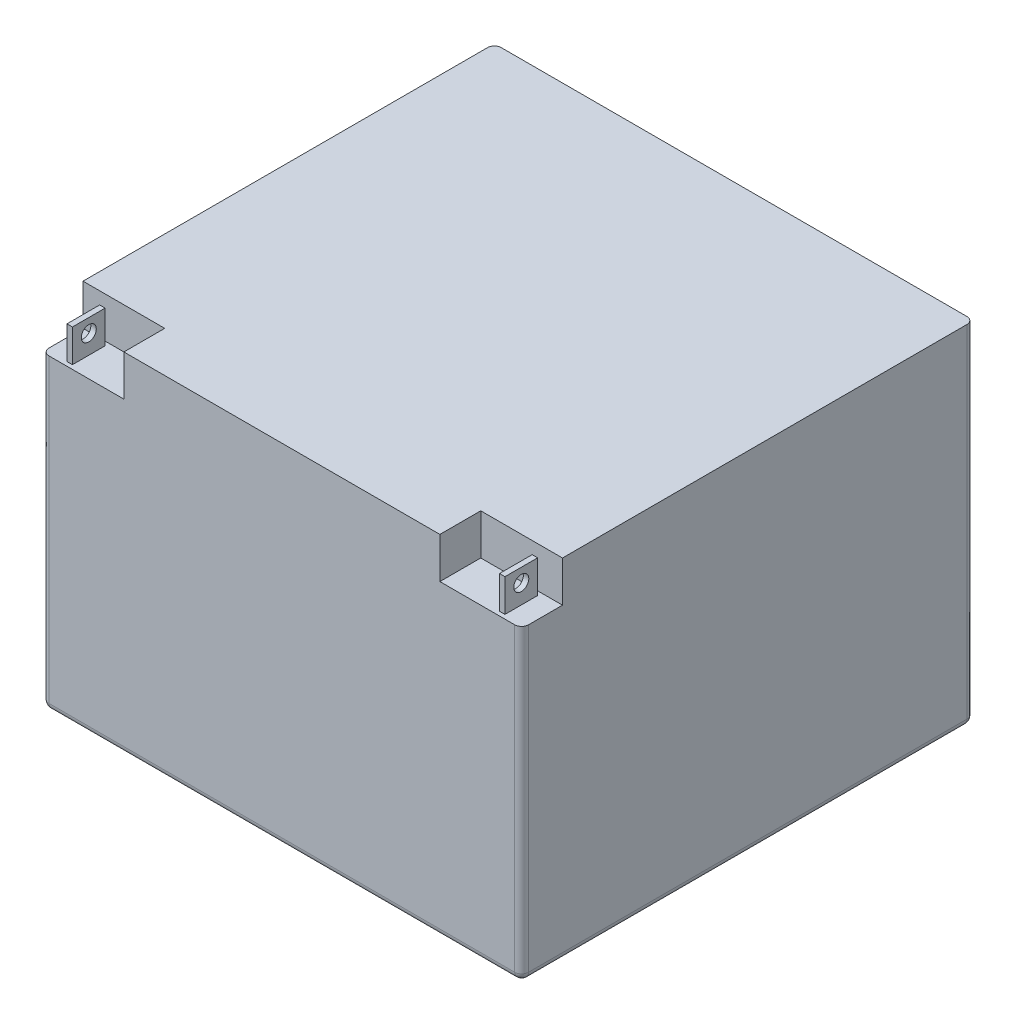
ISO-10303-21;
HEADER;
FILE_DESCRIPTION(('STEP AP214'),'2;1');
FILE_NAME('part.step','',(''),(''),'','','');
FILE_SCHEMA(('AUTOMOTIVE_DESIGN { 1 0 10303 214 1 1 1 1 }'));
ENDSEC;
DATA;
#1=APPLICATION_CONTEXT('core data for automotive mechanical design processes');
#2=APPLICATION_PROTOCOL_DEFINITION('international standard','automotive_design',2000,#1);
#3=PRODUCT_CONTEXT('',#1,'mechanical');
#4=PRODUCT('Part','Part','',(#3));
#5=PRODUCT_RELATED_PRODUCT_CATEGORY('part','',(#4));
#6=PRODUCT_DEFINITION_FORMATION('','',#4);
#7=PRODUCT_DEFINITION_CONTEXT('part definition',#1,'design');
#8=PRODUCT_DEFINITION('design','',#6,#7);
#9=PRODUCT_DEFINITION_SHAPE('','',#8);
#10=(LENGTH_UNIT() NAMED_UNIT(*) SI_UNIT(.MILLI.,.METRE.));
#11=(NAMED_UNIT(*) PLANE_ANGLE_UNIT() SI_UNIT($,.RADIAN.));
#12=(NAMED_UNIT(*) SI_UNIT($,.STERADIAN.) SOLID_ANGLE_UNIT());
#13=UNCERTAINTY_MEASURE_WITH_UNIT(LENGTH_MEASURE(1.E-05),#10,'distance_accuracy_value','');
#14=(GEOMETRIC_REPRESENTATION_CONTEXT(3) GLOBAL_UNCERTAINTY_ASSIGNED_CONTEXT((#13)) GLOBAL_UNIT_ASSIGNED_CONTEXT((#10,
#11,#12)) REPRESENTATION_CONTEXT('',''));
#15=CARTESIAN_POINT('',(0.,0.,0.));
#16=DIRECTION('',(0.,0.,1.));
#17=DIRECTION('',(1.,0.,0.));
#18=AXIS2_PLACEMENT_3D('',#15,#16,#17);
#19=CARTESIAN_POINT('',(0.,113.,0.));
#20=DIRECTION('',(0.,1.,0.));
#21=DIRECTION('',(0.,0.,1.));
#22=AXIS2_PLACEMENT_3D('',#19,#20,#21);
#23=PLANE('',#22);
#24=DIRECTION('',(-1.,0.,0.));
#25=VECTOR('',#24,1.);
#26=CARTESIAN_POINT('',(0.,113.,0.));
#27=LINE('',#26,#25);
#28=CARTESIAN_POINT('',(-58.,113.,0.));
#29=VERTEX_POINT('',#28);
#30=CARTESIAN_POINT('',(-85.46,113.,0.));
#31=VERTEX_POINT('',#30);
#32=EDGE_CURVE('E259',#29,#31,#27,.T.);
#33=ORIENTED_EDGE('',*,*,#32,.F.);
#34=DIRECTION('',(0.,0.,1.));
#35=VECTOR('',#34,1.);
#36=CARTESIAN_POINT('',(-58.,113.,0.));
#37=LINE('',#36,#35);
#38=CARTESIAN_POINT('',(-58.,113.,-15.));
#39=VERTEX_POINT('',#38);
#40=EDGE_CURVE('E262',#39,#29,#37,.T.);
#41=ORIENTED_EDGE('',*,*,#40,.F.);
#42=DIRECTION('',(1.,0.,0.));
#43=VECTOR('',#42,1.);
#44=CARTESIAN_POINT('',(0.,113.,-15.));
#45=LINE('',#44,#43);
#46=CARTESIAN_POINT('',(-88.,113.,-15.));
#47=VERTEX_POINT('',#46);
#48=EDGE_CURVE('E252',#47,#39,#45,.T.);
#49=ORIENTED_EDGE('',*,*,#48,.F.);
#50=DIRECTION('',(0.,0.,-1.));
#51=VECTOR('',#50,1.);
#52=CARTESIAN_POINT('',(-88.,113.,0.));
#53=LINE('',#52,#51);
#54=CARTESIAN_POINT('',(-88.,113.,-2.54));
#55=VERTEX_POINT('',#54);
#56=EDGE_CURVE('E255',#55,#47,#53,.T.);
#57=ORIENTED_EDGE('',*,*,#56,.F.);
#58=CARTESIAN_POINT('',(-85.46,113.,-2.54));
#59=DIRECTION('',(0.,1.,0.));
#60=DIRECTION('',(0.,0.,1.));
#61=AXIS2_PLACEMENT_3D('',#58,#59,#60);
#62=CIRCLE('',#61,2.54);
#63=EDGE_CURVE('E11',#31,#55,#62,.F.);
#64=ORIENTED_EDGE('',*,*,#63,.F.);
#65=EDGE_LOOP('',(#33,#41,#49,#57,#64));
#66=FACE_BOUND('',#65,.T.);
#67=DIRECTION('',(-1.,0.,0.));
#68=VECTOR('',#67,1.);
#69=CARTESIAN_POINT('',(-78.38,113.,-13.5));
#70=LINE('',#69,#68);
#71=CARTESIAN_POINT('',(-78.38,113.,-13.5));
#72=VERTEX_POINT('',#71);
#73=CARTESIAN_POINT('',(-80.38,113.,-13.5));
#74=VERTEX_POINT('',#73);
#75=EDGE_CURVE('E58',#72,#74,#70,.T.);
#76=ORIENTED_EDGE('',*,*,#75,.F.);
#77=DIRECTION('',(0.,0.,1.));
#78=VECTOR('',#77,1.);
#79=CARTESIAN_POINT('',(-78.38,113.,0.));
#80=LINE('',#79,#78);
#81=CARTESIAN_POINT('',(-78.38,113.,-1.5));
#82=VERTEX_POINT('',#81);
#83=EDGE_CURVE('E63',#72,#82,#80,.T.);
#84=ORIENTED_EDGE('',*,*,#83,.T.);
#85=DIRECTION('',(-1.,0.,0.));
#86=VECTOR('',#85,1.);
#87=CARTESIAN_POINT('',(-78.38,113.,-1.5));
#88=LINE('',#87,#86);
#89=CARTESIAN_POINT('',(-80.38,113.,-1.5));
#90=VERTEX_POINT('',#89);
#91=EDGE_CURVE('E220',#82,#90,#88,.T.);
#92=ORIENTED_EDGE('',*,*,#91,.T.);
#93=DIRECTION('',(0.,0.,1.));
#94=VECTOR('',#93,1.);
#95=CARTESIAN_POINT('',(-80.38,113.,0.));
#96=LINE('',#95,#94);
#97=EDGE_CURVE('E239',#74,#90,#96,.T.);
#98=ORIENTED_EDGE('',*,*,#97,.F.);
#99=EDGE_LOOP('',(#76,#84,#92,#98));
#100=FACE_BOUND('',#99,.T.);
#101=ADVANCED_FACE('F43',(#66,#100),#23,.T.);
#102=CARTESIAN_POINT('',(-88.,128.,0.));
#103=DIRECTION('',(1.,0.,0.));
#104=DIRECTION('',(0.,0.,-1.));
#105=AXIS2_PLACEMENT_3D('',#102,#103,#104);
#106=PLANE('',#105);
#107=DIRECTION('',(0.,1.,0.));
#108=VECTOR('',#107,1.);
#109=CARTESIAN_POINT('',(-88.,113.,-15.));
#110=LINE('',#109,#108);
#111=CARTESIAN_POINT('',(-88.,128.,-15.));
#112=VERTEX_POINT('',#111);
#113=EDGE_CURVE('E264',#47,#112,#110,.T.);
#114=ORIENTED_EDGE('',*,*,#113,.T.);
#115=DIRECTION('',(0.,0.,1.));
#116=VECTOR('',#115,1.);
#117=CARTESIAN_POINT('',(-88.,128.,0.));
#118=LINE('',#117,#116);
#119=CARTESIAN_POINT('',(-88.,128.,-163.46));
#120=VERTEX_POINT('',#119);
#121=EDGE_CURVE('E340',#120,#112,#118,.T.);
#122=ORIENTED_EDGE('',*,*,#121,.F.);
#123=DIRECTION('',(0.,-1.,0.));
#124=VECTOR('',#123,1.);
#125=CARTESIAN_POINT('',(-88.,128.,-163.46));
#126=LINE('',#125,#124);
#127=CARTESIAN_POINT('',(-88.,2.53999999999999,-163.46));
#128=VERTEX_POINT('',#127);
#129=EDGE_CURVE('E384',#120,#128,#126,.T.);
#130=ORIENTED_EDGE('',*,*,#129,.T.);
#131=DIRECTION('',(0.,0.,1.));
#132=VECTOR('',#131,1.);
#133=CARTESIAN_POINT('',(-88.,2.53999999999999,0.));
#134=LINE('',#133,#132);
#135=CARTESIAN_POINT('',(-88.,2.53999999999999,-2.54));
#136=VERTEX_POINT('',#135);
#137=EDGE_CURVE('E378',#128,#136,#134,.T.);
#138=ORIENTED_EDGE('',*,*,#137,.T.);
#139=DIRECTION('',(0.,-1.,0.));
#140=VECTOR('',#139,1.);
#141=CARTESIAN_POINT('',(-88.,128.,-2.54));
#142=LINE('',#141,#140);
#143=EDGE_CURVE('E381',#136,#55,#142,.F.);
#144=ORIENTED_EDGE('',*,*,#143,.T.);
#145=ORIENTED_EDGE('',*,*,#56,.T.);
#146=EDGE_LOOP('',(#114,#122,#130,#138,#144,#145));
#147=FACE_BOUND('',#146,.T.);
#148=ADVANCED_FACE('F501',(#147),#106,.F.);
#149=CARTESIAN_POINT('',(-88.,128.,0.));
#150=DIRECTION('',(0.,0.,-1.));
#151=DIRECTION('',(-1.,0.,0.));
#152=AXIS2_PLACEMENT_3D('',#149,#150,#151);
#153=PLANE('',#152);
#154=DIRECTION('',(0.,1.,0.));
#155=VECTOR('',#154,1.);
#156=CARTESIAN_POINT('',(-58.,113.,0.));
#157=LINE('',#156,#155);
#158=CARTESIAN_POINT('',(-58.,128.,0.));
#159=VERTEX_POINT('',#158);
#160=EDGE_CURVE('E273',#29,#159,#157,.T.);
#161=ORIENTED_EDGE('',*,*,#160,.F.);
#162=ORIENTED_EDGE('',*,*,#32,.T.);
#163=DIRECTION('',(0.,-1.,0.));
#164=VECTOR('',#163,1.);
#165=CARTESIAN_POINT('',(-85.46,128.,0.));
#166=LINE('',#165,#164);
#167=CARTESIAN_POINT('',(-85.46,2.53999999999999,0.));
#168=VERTEX_POINT('',#167);
#169=EDGE_CURVE('E391',#31,#168,#166,.T.);
#170=ORIENTED_EDGE('',*,*,#169,.T.);
#171=DIRECTION('',(1.,0.,0.));
#172=VECTOR('',#171,1.);
#173=CARTESIAN_POINT('',(88.,2.53999999999999,0.));
#174=LINE('',#173,#172);
#175=CARTESIAN_POINT('',(85.46,2.53999999999999,0.));
#176=VERTEX_POINT('',#175);
#177=EDGE_CURVE('E387',#168,#176,#174,.T.);
#178=ORIENTED_EDGE('',*,*,#177,.T.);
#179=DIRECTION('',(0.,-1.,0.));
#180=VECTOR('',#179,1.);
#181=CARTESIAN_POINT('',(85.46,128.,0.));
#182=LINE('',#181,#180);
#183=CARTESIAN_POINT('',(85.46,113.,0.));
#184=VERTEX_POINT('',#183);
#185=EDGE_CURVE('E389',#176,#184,#182,.F.);
#186=ORIENTED_EDGE('',*,*,#185,.T.);
#187=DIRECTION('',(1.,0.,0.));
#188=VECTOR('',#187,1.);
#189=CARTESIAN_POINT('',(0.,113.,0.));
#190=LINE('',#189,#188);
#191=CARTESIAN_POINT('',(58.,113.,0.));
#192=VERTEX_POINT('',#191);
#193=EDGE_CURVE('E325',#192,#184,#190,.T.);
#194=ORIENTED_EDGE('',*,*,#193,.F.);
#195=DIRECTION('',(0.,1.,0.));
#196=VECTOR('',#195,1.);
#197=CARTESIAN_POINT('',(58.,113.,0.));
#198=LINE('',#197,#196);
#199=CARTESIAN_POINT('',(58.,128.,0.));
#200=VERTEX_POINT('',#199);
#201=EDGE_CURVE('E341',#192,#200,#198,.T.);
#202=ORIENTED_EDGE('',*,*,#201,.T.);
#203=DIRECTION('',(1.,0.,0.));
#204=VECTOR('',#203,1.);
#205=CARTESIAN_POINT('',(-88.,128.,0.));
#206=LINE('',#205,#204);
#207=EDGE_CURVE('E350',#159,#200,#206,.T.);
#208=ORIENTED_EDGE('',*,*,#207,.F.);
#209=EDGE_LOOP('',(#161,#162,#170,#178,#186,#194,#202,#208));
#210=FACE_BOUND('',#209,.T.);
#211=ADVANCED_FACE('F464',(#210),#153,.F.);
#212=CARTESIAN_POINT('',(0.,128.,0.));
#213=DIRECTION('',(0.,-1.,0.));
#214=DIRECTION('',(0.,0.,-1.));
#215=AXIS2_PLACEMENT_3D('',#212,#213,#214);
#216=PLANE('',#215);
#217=DIRECTION('',(1.,0.,0.));
#218=VECTOR('',#217,1.);
#219=CARTESIAN_POINT('',(0.,128.,-15.));
#220=LINE('',#219,#218);
#221=CARTESIAN_POINT('',(-58.,128.,-15.));
#222=VERTEX_POINT('',#221);
#223=EDGE_CURVE('E249',#112,#222,#220,.T.);
#224=ORIENTED_EDGE('',*,*,#223,.T.);
#225=DIRECTION('',(0.,0.,1.));
#226=VECTOR('',#225,1.);
#227=CARTESIAN_POINT('',(-58.,128.,0.));
#228=LINE('',#227,#226);
#229=EDGE_CURVE('E256',#222,#159,#228,.T.);
#230=ORIENTED_EDGE('',*,*,#229,.T.);
#231=ORIENTED_EDGE('',*,*,#207,.T.);
#232=DIRECTION('',(0.,0.,1.));
#233=VECTOR('',#232,1.);
#234=CARTESIAN_POINT('',(58.,128.,0.));
#235=LINE('',#234,#233);
#236=CARTESIAN_POINT('',(58.,128.,-15.));
#237=VERTEX_POINT('',#236);
#238=EDGE_CURVE('E321',#237,#200,#235,.T.);
#239=ORIENTED_EDGE('',*,*,#238,.F.);
#240=DIRECTION('',(-1.,0.,0.));
#241=VECTOR('',#240,1.);
#242=CARTESIAN_POINT('',(0.,128.,-15.));
#243=LINE('',#242,#241);
#244=CARTESIAN_POINT('',(88.,128.,-15.));
#245=VERTEX_POINT('',#244);
#246=EDGE_CURVE('E331',#245,#237,#243,.T.);
#247=ORIENTED_EDGE('',*,*,#246,.F.);
#248=DIRECTION('',(0.,0.,-1.));
#249=VECTOR('',#248,1.);
#250=CARTESIAN_POINT('',(88.,128.,0.));
#251=LINE('',#250,#249);
#252=CARTESIAN_POINT('',(88.,128.,-163.46));
#253=VERTEX_POINT('',#252);
#254=EDGE_CURVE('E353',#245,#253,#251,.T.);
#255=ORIENTED_EDGE('',*,*,#254,.T.);
#256=CARTESIAN_POINT('',(85.46,128.,-163.46));
#257=DIRECTION('',(0.,-1.,0.));
#258=DIRECTION('',(0.,0.,-1.));
#259=AXIS2_PLACEMENT_3D('',#256,#257,#258);
#260=CIRCLE('',#259,2.54);
#261=CARTESIAN_POINT('',(85.46,128.,-166.));
#262=VERTEX_POINT('',#261);
#263=EDGE_CURVE('E376',#253,#262,#260,.F.);
#264=ORIENTED_EDGE('',*,*,#263,.T.);
#265=DIRECTION('',(-1.,0.,0.));
#266=VECTOR('',#265,1.);
#267=CARTESIAN_POINT('',(-88.,128.,-166.));
#268=LINE('',#267,#266);
#269=CARTESIAN_POINT('',(-85.46,128.,-166.));
#270=VERTEX_POINT('',#269);
#271=EDGE_CURVE('E356',#262,#270,#268,.T.);
#272=ORIENTED_EDGE('',*,*,#271,.T.);
#273=CARTESIAN_POINT('',(-85.46,128.,-163.46));
#274=DIRECTION('',(0.,-1.,0.));
#275=DIRECTION('',(0.,0.,-1.));
#276=AXIS2_PLACEMENT_3D('',#273,#274,#275);
#277=CIRCLE('',#276,2.54);
#278=EDGE_CURVE('E374',#270,#120,#277,.F.);
#279=ORIENTED_EDGE('',*,*,#278,.T.);
#280=ORIENTED_EDGE('',*,*,#121,.T.);
#281=EDGE_LOOP('',(#224,#230,#231,#239,#247,#255,#264,#272,#279,#280));
#282=FACE_BOUND('',#281,.T.);
#283=ADVANCED_FACE('F486',(#282),#216,.F.);
#284=CARTESIAN_POINT('',(-85.46,128.,-2.54));
#285=DIRECTION('',(0.,-1.,0.));
#286=DIRECTION('',(0.,0.,-1.));
#287=AXIS2_PLACEMENT_3D('',#284,#285,#286);
#288=CYLINDRICAL_SURFACE('',#287,2.54);
#289=ORIENTED_EDGE('',*,*,#169,.F.);
#290=ORIENTED_EDGE('',*,*,#63,.T.);
#291=ORIENTED_EDGE('',*,*,#143,.F.);
#292=CARTESIAN_POINT('',(-85.46,2.53999999999999,-2.54));
#293=DIRECTION('',(0.,-1.,0.));
#294=DIRECTION('',(0.,0.,-1.));
#295=AXIS2_PLACEMENT_3D('',#292,#293,#294);
#296=CIRCLE('',#295,2.54);
#297=EDGE_CURVE('E334',#168,#136,#296,.T.);
#298=ORIENTED_EDGE('',*,*,#297,.F.);
#299=EDGE_LOOP('',(#289,#290,#291,#298));
#300=FACE_BOUND('',#299,.T.);
#301=ADVANCED_FACE('F45',(#300),#288,.T.);
#302=CARTESIAN_POINT('',(0.,113.,0.));
#303=DIRECTION('',(0.,1.,0.));
#304=DIRECTION('',(0.,0.,1.));
#305=AXIS2_PLACEMENT_3D('',#302,#303,#304);
#306=PLANE('',#305);
#307=ORIENTED_EDGE('',*,*,#193,.T.);
#308=CARTESIAN_POINT('',(85.46,113.,-2.54));
#309=DIRECTION('',(0.,1.,0.));
#310=DIRECTION('',(0.,0.,1.));
#311=AXIS2_PLACEMENT_3D('',#308,#309,#310);
#312=CIRCLE('',#311,2.54);
#313=CARTESIAN_POINT('',(88.,113.,-2.54));
#314=VERTEX_POINT('',#313);
#315=EDGE_CURVE('E393',#184,#314,#312,.T.);
#316=ORIENTED_EDGE('',*,*,#315,.T.);
#317=DIRECTION('',(0.,0.,-1.));
#318=VECTOR('',#317,1.);
#319=CARTESIAN_POINT('',(88.,113.,0.));
#320=LINE('',#319,#318);
#321=CARTESIAN_POINT('',(88.,113.,-15.));
#322=VERTEX_POINT('',#321);
#323=EDGE_CURVE('E328',#314,#322,#320,.T.);
#324=ORIENTED_EDGE('',*,*,#323,.T.);
#325=DIRECTION('',(-1.,0.,0.));
#326=VECTOR('',#325,1.);
#327=CARTESIAN_POINT('',(0.,113.,-15.));
#328=LINE('',#327,#326);
#329=CARTESIAN_POINT('',(58.,113.,-15.));
#330=VERTEX_POINT('',#329);
#331=EDGE_CURVE('E316',#322,#330,#328,.T.);
#332=ORIENTED_EDGE('',*,*,#331,.T.);
#333=DIRECTION('',(0.,0.,1.));
#334=VECTOR('',#333,1.);
#335=CARTESIAN_POINT('',(58.,113.,0.));
#336=LINE('',#335,#334);
#337=EDGE_CURVE('E320',#330,#192,#336,.T.);
#338=ORIENTED_EDGE('',*,*,#337,.T.);
#339=EDGE_LOOP('',(#307,#316,#324,#332,#338));
#340=FACE_BOUND('',#339,.T.);
#341=DIRECTION('',(1.,0.,0.));
#342=VECTOR('',#341,1.);
#343=CARTESIAN_POINT('',(78.38,113.,-1.5));
#344=LINE('',#343,#342);
#345=CARTESIAN_POINT('',(78.38,113.,-1.5));
#346=VERTEX_POINT('',#345);
#347=CARTESIAN_POINT('',(80.38,113.,-1.5));
#348=VERTEX_POINT('',#347);
#349=EDGE_CURVE('E305',#346,#348,#344,.T.);
#350=ORIENTED_EDGE('',*,*,#349,.F.);
#351=DIRECTION('',(0.,0.,1.));
#352=VECTOR('',#351,1.);
#353=CARTESIAN_POINT('',(78.38,113.,0.));
#354=LINE('',#353,#352);
#355=CARTESIAN_POINT('',(78.38,113.,-13.5));
#356=VERTEX_POINT('',#355);
#357=EDGE_CURVE('E280',#356,#346,#354,.T.);
#358=ORIENTED_EDGE('',*,*,#357,.F.);
#359=DIRECTION('',(1.,0.,0.));
#360=VECTOR('',#359,1.);
#361=CARTESIAN_POINT('',(78.38,113.,-13.5));
#362=LINE('',#361,#360);
#363=CARTESIAN_POINT('',(80.38,113.,-13.5));
#364=VERTEX_POINT('',#363);
#365=EDGE_CURVE('E293',#356,#364,#362,.T.);
#366=ORIENTED_EDGE('',*,*,#365,.T.);
#367=DIRECTION('',(0.,0.,1.));
#368=VECTOR('',#367,1.);
#369=CARTESIAN_POINT('',(80.38,113.,0.));
#370=LINE('',#369,#368);
#371=EDGE_CURVE('E296',#364,#348,#370,.T.);
#372=ORIENTED_EDGE('',*,*,#371,.T.);
#373=EDGE_LOOP('',(#350,#358,#366,#372));
#374=FACE_BOUND('',#373,.T.);
#375=ADVANCED_FACE('F474',(#340,#374),#306,.T.);
#376=CARTESIAN_POINT('',(88.,128.,0.));
#377=DIRECTION('',(-1.,0.,0.));
#378=DIRECTION('',(0.,0.,1.));
#379=AXIS2_PLACEMENT_3D('',#376,#377,#378);
#380=PLANE('',#379);
#381=DIRECTION('',(0.,0.,-1.));
#382=VECTOR('',#381,1.);
#383=CARTESIAN_POINT('',(88.,2.53999999999999,-166.));
#384=LINE('',#383,#382);
#385=CARTESIAN_POINT('',(88.,2.53999999999999,-2.54));
#386=VERTEX_POINT('',#385);
#387=CARTESIAN_POINT('',(88.,2.53999999999999,-163.46));
#388=VERTEX_POINT('',#387);
#389=EDGE_CURVE('E368',#386,#388,#384,.T.);
#390=ORIENTED_EDGE('',*,*,#389,.T.);
#391=DIRECTION('',(0.,-1.,0.));
#392=VECTOR('',#391,1.);
#393=CARTESIAN_POINT('',(88.,128.,-163.46));
#394=LINE('',#393,#392);
#395=EDGE_CURVE('E372',#388,#253,#394,.F.);
#396=ORIENTED_EDGE('',*,*,#395,.T.);
#397=ORIENTED_EDGE('',*,*,#254,.F.);
#398=DIRECTION('',(0.,1.,0.));
#399=VECTOR('',#398,1.);
#400=CARTESIAN_POINT('',(88.,113.,-15.));
#401=LINE('',#400,#399);
#402=EDGE_CURVE('E338',#322,#245,#401,.T.);
#403=ORIENTED_EDGE('',*,*,#402,.F.);
#404=ORIENTED_EDGE('',*,*,#323,.F.);
#405=DIRECTION('',(0.,-1.,0.));
#406=VECTOR('',#405,1.);
#407=CARTESIAN_POINT('',(88.,128.,-2.54));
#408=LINE('',#407,#406);
#409=EDGE_CURVE('E370',#314,#386,#408,.T.);
#410=ORIENTED_EDGE('',*,*,#409,.T.);
#411=EDGE_LOOP('',(#390,#396,#397,#403,#404,#410));
#412=FACE_BOUND('',#411,.T.);
#413=ADVANCED_FACE('F479',(#412),#380,.F.);
#414=CARTESIAN_POINT('',(-88.,128.,-166.));
#415=DIRECTION('',(0.,0.,1.));
#416=DIRECTION('',(1.,0.,0.));
#417=AXIS2_PLACEMENT_3D('',#414,#415,#416);
#418=PLANE('',#417);
#419=ORIENTED_EDGE('',*,*,#271,.F.);
#420=DIRECTION('',(0.,-1.,0.));
#421=VECTOR('',#420,1.);
#422=CARTESIAN_POINT('',(85.46,128.,-166.));
#423=LINE('',#422,#421);
#424=CARTESIAN_POINT('',(85.46,2.53999999999999,-166.));
#425=VERTEX_POINT('',#424);
#426=EDGE_CURVE('E365',#262,#425,#423,.T.);
#427=ORIENTED_EDGE('',*,*,#426,.T.);
#428=DIRECTION('',(-1.,0.,0.));
#429=VECTOR('',#428,1.);
#430=CARTESIAN_POINT('',(-88.,2.53999999999999,-166.));
#431=LINE('',#430,#429);
#432=CARTESIAN_POINT('',(-85.46,2.53999999999999,-166.));
#433=VERTEX_POINT('',#432);
#434=EDGE_CURVE('E359',#425,#433,#431,.T.);
#435=ORIENTED_EDGE('',*,*,#434,.T.);
#436=DIRECTION('',(0.,-1.,0.));
#437=VECTOR('',#436,1.);
#438=CARTESIAN_POINT('',(-85.46,128.,-166.));
#439=LINE('',#438,#437);
#440=EDGE_CURVE('E362',#433,#270,#439,.F.);
#441=ORIENTED_EDGE('',*,*,#440,.T.);
#442=EDGE_LOOP('',(#419,#427,#435,#441));
#443=FACE_BOUND('',#442,.T.);
#444=ADVANCED_FACE('F557',(#443),#418,.F.);
#445=CARTESIAN_POINT('',(0.,0.,0.));
#446=DIRECTION('',(0.,-1.,0.));
#447=DIRECTION('',(0.,0.,-1.));
#448=AXIS2_PLACEMENT_3D('',#445,#446,#447);
#449=PLANE('',#448);
#450=DIRECTION('',(0.,0.,1.));
#451=VECTOR('',#450,1.);
#452=CARTESIAN_POINT('',(-85.46,0.,-166.));
#453=LINE('',#452,#451);
#454=CARTESIAN_POINT('',(-85.46,0.,-2.54));
#455=VERTEX_POINT('',#454);
#456=CARTESIAN_POINT('',(-85.46,0.,-163.46));
#457=VERTEX_POINT('',#456);
#458=EDGE_CURVE('E399',#455,#457,#453,.F.);
#459=ORIENTED_EDGE('',*,*,#458,.T.);
#460=DIRECTION('',(-1.,0.,0.));
#461=VECTOR('',#460,1.);
#462=CARTESIAN_POINT('',(88.,0.,-163.46));
#463=LINE('',#462,#461);
#464=CARTESIAN_POINT('',(85.46,0.,-163.46));
#465=VERTEX_POINT('',#464);
#466=EDGE_CURVE('E51',#457,#465,#463,.F.);
#467=ORIENTED_EDGE('',*,*,#466,.T.);
#468=DIRECTION('',(0.,0.,-1.));
#469=VECTOR('',#468,1.);
#470=CARTESIAN_POINT('',(85.46,0.,0.));
#471=LINE('',#470,#469);
#472=CARTESIAN_POINT('',(85.46,0.,-2.54));
#473=VERTEX_POINT('',#472);
#474=EDGE_CURVE('E395',#465,#473,#471,.F.);
#475=ORIENTED_EDGE('',*,*,#474,.T.);
#476=DIRECTION('',(1.,0.,0.));
#477=VECTOR('',#476,1.);
#478=CARTESIAN_POINT('',(-88.,0.,-2.54));
#479=LINE('',#478,#477);
#480=EDGE_CURVE('E397',#473,#455,#479,.F.);
#481=ORIENTED_EDGE('',*,*,#480,.T.);
#482=EDGE_LOOP('',(#459,#467,#475,#481));
#483=FACE_BOUND('',#482,.T.);
#484=ADVANCED_FACE('F454',(#483),#449,.T.);
#485=CARTESIAN_POINT('',(0.,113.,-15.));
#486=DIRECTION('',(0.,0.,-1.));
#487=DIRECTION('',(-1.,0.,0.));
#488=AXIS2_PLACEMENT_3D('',#485,#486,#487);
#489=PLANE('',#488);
#490=ORIENTED_EDGE('',*,*,#246,.T.);
#491=DIRECTION('',(0.,1.,0.));
#492=VECTOR('',#491,1.);
#493=CARTESIAN_POINT('',(58.,113.,-15.));
#494=LINE('',#493,#492);
#495=EDGE_CURVE('E330',#330,#237,#494,.T.);
#496=ORIENTED_EDGE('',*,*,#495,.F.);
#497=ORIENTED_EDGE('',*,*,#331,.F.);
#498=ORIENTED_EDGE('',*,*,#402,.T.);
#499=EDGE_LOOP('',(#490,#496,#497,#498));
#500=FACE_BOUND('',#499,.T.);
#501=ADVANCED_FACE('F483',(#500),#489,.F.);
#502=CARTESIAN_POINT('',(58.,113.,0.));
#503=DIRECTION('',(-1.,0.,0.));
#504=DIRECTION('',(0.,0.,1.));
#505=AXIS2_PLACEMENT_3D('',#502,#503,#504);
#506=PLANE('',#505);
#507=ORIENTED_EDGE('',*,*,#238,.T.);
#508=ORIENTED_EDGE('',*,*,#201,.F.);
#509=ORIENTED_EDGE('',*,*,#337,.F.);
#510=ORIENTED_EDGE('',*,*,#495,.T.);
#511=EDGE_LOOP('',(#507,#508,#509,#510));
#512=FACE_BOUND('',#511,.T.);
#513=ADVANCED_FACE('F490',(#512),#506,.F.);
#514=CARTESIAN_POINT('',(-85.46,2.54,-2.54));
#515=DIRECTION('',(0.,0.,1.));
#516=DIRECTION('',(1.,0.,0.));
#517=AXIS2_PLACEMENT_3D('',#514,#515,#516);
#518=SPHERICAL_SURFACE('',#517,2.54);
#519=CARTESIAN_POINT('',(-85.46,2.54,-2.54));
#520=DIRECTION('',(-1.,0.,0.));
#521=DIRECTION('',(0.,0.,1.));
#522=AXIS2_PLACEMENT_3D('',#519,#520,#521);
#523=CIRCLE('',#522,2.54);
#524=EDGE_CURVE('E431',#168,#455,#523,.F.);
#525=ORIENTED_EDGE('',*,*,#524,.F.);
#526=ORIENTED_EDGE('',*,*,#297,.T.);
#527=CARTESIAN_POINT('',(-85.46,2.53999999999999,-2.54));
#528=DIRECTION('',(0.,0.,1.));
#529=DIRECTION('',(1.,0.,0.));
#530=AXIS2_PLACEMENT_3D('',#527,#528,#529);
#531=CIRCLE('',#530,2.54);
#532=EDGE_CURVE('E434',#455,#136,#531,.F.);
#533=ORIENTED_EDGE('',*,*,#532,.F.);
#534=EDGE_LOOP('',(#525,#526,#533));
#535=FACE_BOUND('',#534,.T.);
#536=ADVANCED_FACE('F441',(#535),#518,.T.);
#537=CARTESIAN_POINT('',(-85.46,128.,-163.46));
#538=DIRECTION('',(0.,-1.,0.));
#539=DIRECTION('',(0.,0.,-1.));
#540=AXIS2_PLACEMENT_3D('',#537,#538,#539);
#541=CYLINDRICAL_SURFACE('',#540,2.54);
#542=ORIENTED_EDGE('',*,*,#278,.F.);
#543=ORIENTED_EDGE('',*,*,#440,.F.);
#544=CARTESIAN_POINT('',(-85.46,2.53999999999999,-163.46));
#545=DIRECTION('',(0.,-1.,0.));
#546=DIRECTION('',(0.,0.,-1.));
#547=AXIS2_PLACEMENT_3D('',#544,#545,#546);
#548=CIRCLE('',#547,2.54);
#549=EDGE_CURVE('E427',#128,#433,#548,.T.);
#550=ORIENTED_EDGE('',*,*,#549,.F.);
#551=ORIENTED_EDGE('',*,*,#129,.F.);
#552=EDGE_LOOP('',(#542,#543,#550,#551));
#553=FACE_BOUND('',#552,.T.);
#554=ADVANCED_FACE('F594',(#553),#541,.T.);
#555=CARTESIAN_POINT('',(-85.46,2.53999999999999,0.));
#556=DIRECTION('',(0.,0.,-1.));
#557=DIRECTION('',(-1.,0.,0.));
#558=AXIS2_PLACEMENT_3D('',#555,#556,#557);
#559=CYLINDRICAL_SURFACE('',#558,2.54);
#560=ORIENTED_EDGE('',*,*,#532,.T.);
#561=ORIENTED_EDGE('',*,*,#137,.F.);
#562=CARTESIAN_POINT('',(-85.46,2.54,-163.46));
#563=DIRECTION('',(0.,0.,-1.));
#564=DIRECTION('',(-1.,0.,0.));
#565=AXIS2_PLACEMENT_3D('',#562,#563,#564);
#566=CIRCLE('',#565,2.54);
#567=EDGE_CURVE('E423',#457,#128,#566,.T.);
#568=ORIENTED_EDGE('',*,*,#567,.F.);
#569=ORIENTED_EDGE('',*,*,#458,.F.);
#570=EDGE_LOOP('',(#560,#561,#568,#569));
#571=FACE_BOUND('',#570,.T.);
#572=ADVANCED_FACE('F449',(#571),#559,.T.);
#573=CARTESIAN_POINT('',(-88.,2.53999999999999,-2.54));
#574=DIRECTION('',(-1.,0.,0.));
#575=DIRECTION('',(0.,0.,1.));
#576=AXIS2_PLACEMENT_3D('',#573,#574,#575);
#577=CYLINDRICAL_SURFACE('',#576,2.54);
#578=ORIENTED_EDGE('',*,*,#524,.T.);
#579=ORIENTED_EDGE('',*,*,#480,.F.);
#580=CARTESIAN_POINT('',(85.46,2.53999999999999,-2.54));
#581=DIRECTION('',(1.,0.,0.));
#582=DIRECTION('',(0.,0.,-1.));
#583=AXIS2_PLACEMENT_3D('',#580,#581,#582);
#584=CIRCLE('',#583,2.54);
#585=EDGE_CURVE('E420',#176,#473,#584,.T.);
#586=ORIENTED_EDGE('',*,*,#585,.F.);
#587=ORIENTED_EDGE('',*,*,#177,.F.);
#588=EDGE_LOOP('',(#578,#579,#586,#587));
#589=FACE_BOUND('',#588,.T.);
#590=ADVANCED_FACE('F460',(#589),#577,.T.);
#591=CARTESIAN_POINT('',(85.46,128.,-2.54));
#592=DIRECTION('',(0.,-1.,0.));
#593=DIRECTION('',(0.,0.,-1.));
#594=AXIS2_PLACEMENT_3D('',#591,#592,#593);
#595=CYLINDRICAL_SURFACE('',#594,2.54);
#596=ORIENTED_EDGE('',*,*,#315,.F.);
#597=ORIENTED_EDGE('',*,*,#185,.F.);
#598=CARTESIAN_POINT('',(85.46,2.53999999999999,-2.54));
#599=DIRECTION('',(0.,-1.,0.));
#600=DIRECTION('',(0.,0.,-1.));
#601=AXIS2_PLACEMENT_3D('',#598,#599,#600);
#602=CIRCLE('',#601,2.54);
#603=EDGE_CURVE('E417',#386,#176,#602,.T.);
#604=ORIENTED_EDGE('',*,*,#603,.F.);
#605=ORIENTED_EDGE('',*,*,#409,.F.);
#606=EDGE_LOOP('',(#596,#597,#604,#605));
#607=FACE_BOUND('',#606,.T.);
#608=ADVANCED_FACE('F469',(#607),#595,.T.);
#609=CARTESIAN_POINT('',(-85.46,2.54,-163.46));
#610=DIRECTION('',(0.,0.,1.));
#611=DIRECTION('',(1.,0.,0.));
#612=AXIS2_PLACEMENT_3D('',#609,#610,#611);
#613=SPHERICAL_SURFACE('',#612,2.54);
#614=ORIENTED_EDGE('',*,*,#567,.T.);
#615=ORIENTED_EDGE('',*,*,#549,.T.);
#616=CARTESIAN_POINT('',(-85.46,2.53999999999999,-163.46));
#617=DIRECTION('',(-1.,0.,0.));
#618=DIRECTION('',(0.,0.,1.));
#619=AXIS2_PLACEMENT_3D('',#616,#617,#618);
#620=CIRCLE('',#619,2.54);
#621=EDGE_CURVE('E413',#457,#433,#620,.F.);
#622=ORIENTED_EDGE('',*,*,#621,.F.);
#623=EDGE_LOOP('',(#614,#615,#622));
#624=FACE_BOUND('',#623,.T.);
#625=ADVANCED_FACE('F583',(#624),#613,.T.);
#626=CARTESIAN_POINT('',(85.46,2.54,-2.54));
#627=DIRECTION('',(0.,0.,1.));
#628=DIRECTION('',(1.,0.,0.));
#629=AXIS2_PLACEMENT_3D('',#626,#627,#628);
#630=SPHERICAL_SURFACE('',#629,2.54);
#631=ORIENTED_EDGE('',*,*,#603,.T.);
#632=ORIENTED_EDGE('',*,*,#585,.T.);
#633=CARTESIAN_POINT('',(85.46,2.54,-2.54));
#634=DIRECTION('',(0.,0.,1.));
#635=DIRECTION('',(1.,0.,0.));
#636=AXIS2_PLACEMENT_3D('',#633,#634,#635);
#637=CIRCLE('',#636,2.54);
#638=EDGE_CURVE('E410',#386,#473,#637,.F.);
#639=ORIENTED_EDGE('',*,*,#638,.F.);
#640=EDGE_LOOP('',(#631,#632,#639));
#641=FACE_BOUND('',#640,.T.);
#642=ADVANCED_FACE('F579',(#641),#630,.T.);
#643=CARTESIAN_POINT('',(-88.,2.53999999999999,-163.46));
#644=DIRECTION('',(1.,0.,0.));
#645=DIRECTION('',(0.,0.,-1.));
#646=AXIS2_PLACEMENT_3D('',#643,#644,#645);
#647=CYLINDRICAL_SURFACE('',#646,2.54);
#648=ORIENTED_EDGE('',*,*,#621,.T.);
#649=ORIENTED_EDGE('',*,*,#434,.F.);
#650=CARTESIAN_POINT('',(85.46,2.54,-163.46));
#651=DIRECTION('',(1.,0.,0.));
#652=DIRECTION('',(0.,0.,-1.));
#653=AXIS2_PLACEMENT_3D('',#650,#651,#652);
#654=CIRCLE('',#653,2.54);
#655=EDGE_CURVE('E407',#465,#425,#654,.T.);
#656=ORIENTED_EDGE('',*,*,#655,.F.);
#657=ORIENTED_EDGE('',*,*,#466,.F.);
#658=EDGE_LOOP('',(#648,#649,#656,#657));
#659=FACE_BOUND('',#658,.T.);
#660=ADVANCED_FACE('F575',(#659),#647,.T.);
#661=CARTESIAN_POINT('',(85.46,2.53999999999999,0.));
#662=DIRECTION('',(0.,0.,1.));
#663=DIRECTION('',(1.,0.,0.));
#664=AXIS2_PLACEMENT_3D('',#661,#662,#663);
#665=CYLINDRICAL_SURFACE('',#664,2.54);
#666=ORIENTED_EDGE('',*,*,#638,.T.);
#667=ORIENTED_EDGE('',*,*,#474,.F.);
#668=CARTESIAN_POINT('',(85.46,2.53999999999999,-163.46));
#669=DIRECTION('',(0.,0.,-1.));
#670=DIRECTION('',(-1.,0.,0.));
#671=AXIS2_PLACEMENT_3D('',#668,#669,#670);
#672=CIRCLE('',#671,2.54);
#673=EDGE_CURVE('E405',#388,#465,#672,.T.);
#674=ORIENTED_EDGE('',*,*,#673,.F.);
#675=ORIENTED_EDGE('',*,*,#389,.F.);
#676=EDGE_LOOP('',(#666,#667,#674,#675));
#677=FACE_BOUND('',#676,.T.);
#678=ADVANCED_FACE('F571',(#677),#665,.T.);
#679=CARTESIAN_POINT('',(85.46,2.54,-163.46));
#680=DIRECTION('',(0.,0.,1.));
#681=DIRECTION('',(1.,0.,0.));
#682=AXIS2_PLACEMENT_3D('',#679,#680,#681);
#683=SPHERICAL_SURFACE('',#682,2.54);
#684=ORIENTED_EDGE('',*,*,#673,.T.);
#685=ORIENTED_EDGE('',*,*,#655,.T.);
#686=CARTESIAN_POINT('',(85.46,2.53999999999999,-163.46));
#687=DIRECTION('',(0.,-1.,0.));
#688=DIRECTION('',(0.,0.,-1.));
#689=AXIS2_PLACEMENT_3D('',#686,#687,#688);
#690=CIRCLE('',#689,2.54);
#691=EDGE_CURVE('E308',#388,#425,#690,.F.);
#692=ORIENTED_EDGE('',*,*,#691,.F.);
#693=EDGE_LOOP('',(#684,#685,#692));
#694=FACE_BOUND('',#693,.T.);
#695=ADVANCED_FACE('F567',(#694),#683,.T.);
#696=CARTESIAN_POINT('',(85.46,128.,-163.46));
#697=DIRECTION('',(0.,-1.,0.));
#698=DIRECTION('',(0.,0.,-1.));
#699=AXIS2_PLACEMENT_3D('',#696,#697,#698);
#700=CYLINDRICAL_SURFACE('',#699,2.54);
#701=ORIENTED_EDGE('',*,*,#263,.F.);
#702=ORIENTED_EDGE('',*,*,#395,.F.);
#703=ORIENTED_EDGE('',*,*,#691,.T.);
#704=ORIENTED_EDGE('',*,*,#426,.F.);
#705=EDGE_LOOP('',(#701,#702,#703,#704));
#706=FACE_BOUND('',#705,.T.);
#707=ADVANCED_FACE('F539',(#706),#700,.T.);
#708=CARTESIAN_POINT('',(78.38,0.,-1.5));
#709=DIRECTION('',(0.,0.,-1.));
#710=DIRECTION('',(-1.,0.,0.));
#711=AXIS2_PLACEMENT_3D('',#708,#709,#710);
#712=PLANE('',#711);
#713=DIRECTION('',(0.,1.,0.));
#714=VECTOR('',#713,1.);
#715=CARTESIAN_POINT('',(80.38,0.,-1.5));
#716=LINE('',#715,#714);
#717=CARTESIAN_POINT('',(80.38,125.,-1.5));
#718=VERTEX_POINT('',#717);
#719=EDGE_CURVE('E281',#348,#718,#716,.T.);
#720=ORIENTED_EDGE('',*,*,#719,.T.);
#721=DIRECTION('',(1.,0.,0.));
#722=VECTOR('',#721,1.);
#723=CARTESIAN_POINT('',(78.38,125.,-1.5));
#724=LINE('',#723,#722);
#725=CARTESIAN_POINT('',(78.38,125.,-1.5));
#726=VERTEX_POINT('',#725);
#727=EDGE_CURVE('E309',#726,#718,#724,.T.);
#728=ORIENTED_EDGE('',*,*,#727,.F.);
#729=DIRECTION('',(0.,1.,0.));
#730=VECTOR('',#729,1.);
#731=CARTESIAN_POINT('',(78.38,0.,-1.5));
#732=LINE('',#731,#730);
#733=EDGE_CURVE('E291',#346,#726,#732,.T.);
#734=ORIENTED_EDGE('',*,*,#733,.F.);
#735=ORIENTED_EDGE('',*,*,#349,.T.);
#736=EDGE_LOOP('',(#720,#728,#734,#735));
#737=FACE_BOUND('',#736,.T.);
#738=ADVANCED_FACE('F535',(#737),#712,.F.);
#739=CARTESIAN_POINT('',(78.38,125.,0.));
#740=DIRECTION('',(0.,-1.,0.));
#741=DIRECTION('',(0.,0.,-1.));
#742=AXIS2_PLACEMENT_3D('',#739,#740,#741);
#743=PLANE('',#742);
#744=DIRECTION('',(0.,0.,-1.));
#745=VECTOR('',#744,1.);
#746=CARTESIAN_POINT('',(80.38,125.,0.));
#747=LINE('',#746,#745);
#748=CARTESIAN_POINT('',(80.38,125.,-13.5));
#749=VERTEX_POINT('',#748);
#750=EDGE_CURVE('E301',#718,#749,#747,.T.);
#751=ORIENTED_EDGE('',*,*,#750,.T.);
#752=DIRECTION('',(1.,0.,0.));
#753=VECTOR('',#752,1.);
#754=CARTESIAN_POINT('',(78.38,125.,-13.5));
#755=LINE('',#754,#753);
#756=CARTESIAN_POINT('',(78.38,125.,-13.5));
#757=VERTEX_POINT('',#756);
#758=EDGE_CURVE('E312',#757,#749,#755,.T.);
#759=ORIENTED_EDGE('',*,*,#758,.F.);
#760=DIRECTION('',(0.,0.,-1.));
#761=VECTOR('',#760,1.);
#762=CARTESIAN_POINT('',(78.38,125.,0.));
#763=LINE('',#762,#761);
#764=EDGE_CURVE('E289',#726,#757,#763,.T.);
#765=ORIENTED_EDGE('',*,*,#764,.F.);
#766=ORIENTED_EDGE('',*,*,#727,.T.);
#767=EDGE_LOOP('',(#751,#759,#765,#766));
#768=FACE_BOUND('',#767,.T.);
#769=ADVANCED_FACE('F538',(#768),#743,.F.);
#770=CARTESIAN_POINT('',(78.38,120.,-7.50000000000001));
#771=DIRECTION('',(1.,0.,0.));
#772=DIRECTION('',(0.,0.,-1.));
#773=AXIS2_PLACEMENT_3D('',#770,#771,#772);
#774=CYLINDRICAL_SURFACE('',#773,2.75);
#775=CARTESIAN_POINT('',(78.38,120.,-7.50000000000001));
#776=DIRECTION('',(1.,0.,0.));
#777=DIRECTION('',(0.,0.,-1.));
#778=AXIS2_PLACEMENT_3D('',#775,#776,#777);
#779=CIRCLE('',#778,2.75);
#780=CARTESIAN_POINT('',(78.38,120.,-10.25));
#781=VERTEX_POINT('',#780);
#782=EDGE_CURVE('E277',#781,#781,#779,.T.);
#783=ORIENTED_EDGE('',*,*,#782,.F.);
#784=EDGE_LOOP('',(#783));
#785=FACE_BOUND('',#784,.T.);
#786=CARTESIAN_POINT('',(80.38,120.,-7.50000000000001));
#787=DIRECTION('',(1.,0.,0.));
#788=DIRECTION('',(0.,0.,-1.));
#789=AXIS2_PLACEMENT_3D('',#786,#787,#788);
#790=CIRCLE('',#789,2.75);
#791=CARTESIAN_POINT('',(80.38,120.,-10.25));
#792=VERTEX_POINT('',#791);
#793=EDGE_CURVE('E272',#792,#792,#790,.T.);
#794=ORIENTED_EDGE('',*,*,#793,.T.);
#795=EDGE_LOOP('',(#794));
#796=FACE_BOUND('',#795,.T.);
#797=ADVANCED_FACE('F543',(#785,#796),#774,.F.);
#798=CARTESIAN_POINT('',(78.38,0.,-13.5));
#799=DIRECTION('',(0.,0.,-1.));
#800=DIRECTION('',(-1.,0.,0.));
#801=AXIS2_PLACEMENT_3D('',#798,#799,#800);
#802=PLANE('',#801);
#803=DIRECTION('',(0.,1.,0.));
#804=VECTOR('',#803,1.);
#805=CARTESIAN_POINT('',(80.38,0.,-13.5));
#806=LINE('',#805,#804);
#807=EDGE_CURVE('E298',#364,#749,#806,.T.);
#808=ORIENTED_EDGE('',*,*,#807,.F.);
#809=ORIENTED_EDGE('',*,*,#365,.F.);
#810=DIRECTION('',(0.,1.,0.));
#811=VECTOR('',#810,1.);
#812=CARTESIAN_POINT('',(78.38,0.,-13.5));
#813=LINE('',#812,#811);
#814=EDGE_CURVE('E285',#356,#757,#813,.T.);
#815=ORIENTED_EDGE('',*,*,#814,.T.);
#816=ORIENTED_EDGE('',*,*,#758,.T.);
#817=EDGE_LOOP('',(#808,#809,#815,#816));
#818=FACE_BOUND('',#817,.T.);
#819=ADVANCED_FACE('F530',(#818),#802,.T.);
#820=CARTESIAN_POINT('',(78.38,0.,0.));
#821=DIRECTION('',(1.,0.,0.));
#822=DIRECTION('',(0.,0.,-1.));
#823=AXIS2_PLACEMENT_3D('',#820,#821,#822);
#824=PLANE('',#823);
#825=ORIENTED_EDGE('',*,*,#782,.T.);
#826=EDGE_LOOP('',(#825));
#827=FACE_BOUND('',#826,.T.);
#828=ORIENTED_EDGE('',*,*,#357,.T.);
#829=ORIENTED_EDGE('',*,*,#733,.T.);
#830=ORIENTED_EDGE('',*,*,#764,.T.);
#831=ORIENTED_EDGE('',*,*,#814,.F.);
#832=EDGE_LOOP('',(#828,#829,#830,#831));
#833=FACE_BOUND('',#832,.T.);
#834=ADVANCED_FACE('F527',(#827,#833),#824,.F.);
#835=CARTESIAN_POINT('',(80.38,0.,0.));
#836=DIRECTION('',(1.,0.,0.));
#837=DIRECTION('',(0.,0.,-1.));
#838=AXIS2_PLACEMENT_3D('',#835,#836,#837);
#839=PLANE('',#838);
#840=ORIENTED_EDGE('',*,*,#793,.F.);
#841=EDGE_LOOP('',(#840));
#842=FACE_BOUND('',#841,.T.);
#843=ORIENTED_EDGE('',*,*,#371,.F.);
#844=ORIENTED_EDGE('',*,*,#807,.T.);
#845=ORIENTED_EDGE('',*,*,#750,.F.);
#846=ORIENTED_EDGE('',*,*,#719,.F.);
#847=EDGE_LOOP('',(#843,#844,#845,#846));
#848=FACE_BOUND('',#847,.T.);
#849=ADVANCED_FACE('F526',(#842,#848),#839,.T.);
#850=CARTESIAN_POINT('',(0.,113.,-15.));
#851=DIRECTION('',(0.,0.,1.));
#852=DIRECTION('',(1.,0.,0.));
#853=AXIS2_PLACEMENT_3D('',#850,#851,#852);
#854=PLANE('',#853);
#855=ORIENTED_EDGE('',*,*,#223,.F.);
#856=ORIENTED_EDGE('',*,*,#113,.F.);
#857=ORIENTED_EDGE('',*,*,#48,.T.);
#858=DIRECTION('',(0.,1.,0.));
#859=VECTOR('',#858,1.);
#860=CARTESIAN_POINT('',(-58.,113.,-15.));
#861=LINE('',#860,#859);
#862=EDGE_CURVE('E269',#39,#222,#861,.T.);
#863=ORIENTED_EDGE('',*,*,#862,.T.);
#864=EDGE_LOOP('',(#855,#856,#857,#863));
#865=FACE_BOUND('',#864,.T.);
#866=ADVANCED_FACE('F498',(#865),#854,.T.);
#867=CARTESIAN_POINT('',(-58.,113.,0.));
#868=DIRECTION('',(-1.,0.,0.));
#869=DIRECTION('',(0.,0.,1.));
#870=AXIS2_PLACEMENT_3D('',#867,#868,#869);
#871=PLANE('',#870);
#872=ORIENTED_EDGE('',*,*,#229,.F.);
#873=ORIENTED_EDGE('',*,*,#862,.F.);
#874=ORIENTED_EDGE('',*,*,#40,.T.);
#875=ORIENTED_EDGE('',*,*,#160,.T.);
#876=EDGE_LOOP('',(#872,#873,#874,#875));
#877=FACE_BOUND('',#876,.T.);
#878=ADVANCED_FACE('F494',(#877),#871,.T.);
#879=CARTESIAN_POINT('',(-78.38,0.,-13.5));
#880=DIRECTION('',(0.,0.,1.));
#881=DIRECTION('',(1.,0.,0.));
#882=AXIS2_PLACEMENT_3D('',#879,#880,#881);
#883=PLANE('',#882);
#884=DIRECTION('',(0.,1.,0.));
#885=VECTOR('',#884,1.);
#886=CARTESIAN_POINT('',(-80.38,0.,-13.5));
#887=LINE('',#886,#885);
#888=CARTESIAN_POINT('',(-80.38,125.,-13.5));
#889=VERTEX_POINT('',#888);
#890=EDGE_CURVE('E245',#74,#889,#887,.T.);
#891=ORIENTED_EDGE('',*,*,#890,.T.);
#892=DIRECTION('',(-1.,0.,0.));
#893=VECTOR('',#892,1.);
#894=CARTESIAN_POINT('',(-78.38,125.,-13.5));
#895=LINE('',#894,#893);
#896=CARTESIAN_POINT('',(-78.38,125.,-13.5));
#897=VERTEX_POINT('',#896);
#898=EDGE_CURVE('E219',#897,#889,#895,.T.);
#899=ORIENTED_EDGE('',*,*,#898,.F.);
#900=DIRECTION('',(0.,1.,0.));
#901=VECTOR('',#900,1.);
#902=CARTESIAN_POINT('',(-78.38,0.,-13.5));
#903=LINE('',#902,#901);
#904=EDGE_CURVE('E226',#72,#897,#903,.T.);
#905=ORIENTED_EDGE('',*,*,#904,.F.);
#906=ORIENTED_EDGE('',*,*,#75,.T.);
#907=EDGE_LOOP('',(#891,#899,#905,#906));
#908=FACE_BOUND('',#907,.T.);
#909=ADVANCED_FACE('F523',(#908),#883,.F.);
#910=CARTESIAN_POINT('',(-78.38,125.,0.));
#911=DIRECTION('',(0.,1.,0.));
#912=DIRECTION('',(0.,0.,1.));
#913=AXIS2_PLACEMENT_3D('',#910,#911,#912);
#914=PLANE('',#913);
#915=DIRECTION('',(0.,0.,-1.));
#916=VECTOR('',#915,1.);
#917=CARTESIAN_POINT('',(-80.38,125.,0.));
#918=LINE('',#917,#916);
#919=CARTESIAN_POINT('',(-80.38,125.,-1.5));
#920=VERTEX_POINT('',#919);
#921=EDGE_CURVE('E214',#920,#889,#918,.T.);
#922=ORIENTED_EDGE('',*,*,#921,.F.);
#923=DIRECTION('',(-1.,0.,0.));
#924=VECTOR('',#923,1.);
#925=CARTESIAN_POINT('',(-78.38,125.,-1.5));
#926=LINE('',#925,#924);
#927=CARTESIAN_POINT('',(-78.38,125.,-1.5));
#928=VERTEX_POINT('',#927);
#929=EDGE_CURVE('E209',#928,#920,#926,.T.);
#930=ORIENTED_EDGE('',*,*,#929,.F.);
#931=DIRECTION('',(0.,0.,-1.));
#932=VECTOR('',#931,1.);
#933=CARTESIAN_POINT('',(-78.38,125.,0.));
#934=LINE('',#933,#932);
#935=EDGE_CURVE('E212',#928,#897,#934,.T.);
#936=ORIENTED_EDGE('',*,*,#935,.T.);
#937=ORIENTED_EDGE('',*,*,#898,.T.);
#938=EDGE_LOOP('',(#922,#930,#936,#937));
#939=FACE_BOUND('',#938,.T.);
#940=ADVANCED_FACE('F211',(#939),#914,.T.);
#941=CARTESIAN_POINT('',(-78.38,120.,-7.50000000000001));
#942=DIRECTION('',(-1.,0.,0.));
#943=DIRECTION('',(0.,0.,1.));
#944=AXIS2_PLACEMENT_3D('',#941,#942,#943);
#945=CYLINDRICAL_SURFACE('',#944,2.75);
#946=CARTESIAN_POINT('',(-78.38,120.,-7.50000000000001));
#947=DIRECTION('',(1.,0.,0.));
#948=DIRECTION('',(0.,0.,-1.));
#949=AXIS2_PLACEMENT_3D('',#946,#947,#948);
#950=CIRCLE('',#949,2.75);
#951=CARTESIAN_POINT('',(-78.38,120.,-10.25));
#952=VERTEX_POINT('',#951);
#953=EDGE_CURVE('E231',#952,#952,#950,.T.);
#954=ORIENTED_EDGE('',*,*,#953,.T.);
#955=EDGE_LOOP('',(#954));
#956=FACE_BOUND('',#955,.T.);
#957=CARTESIAN_POINT('',(-80.38,120.,-7.50000000000001));
#958=DIRECTION('',(1.,0.,0.));
#959=DIRECTION('',(0.,0.,-1.));
#960=AXIS2_PLACEMENT_3D('',#957,#958,#959);
#961=CIRCLE('',#960,2.75);
#962=CARTESIAN_POINT('',(-80.38,120.,-10.25));
#963=VERTEX_POINT('',#962);
#964=EDGE_CURVE('E236',#963,#963,#961,.T.);
#965=ORIENTED_EDGE('',*,*,#964,.F.);
#966=EDGE_LOOP('',(#965));
#967=FACE_BOUND('',#966,.T.);
#968=ADVANCED_FACE('F519',(#956,#967),#945,.F.);
#969=CARTESIAN_POINT('',(-78.38,0.,-1.5));
#970=DIRECTION('',(0.,0.,1.));
#971=DIRECTION('',(1.,0.,0.));
#972=AXIS2_PLACEMENT_3D('',#969,#970,#971);
#973=PLANE('',#972);
#974=DIRECTION('',(0.,1.,0.));
#975=VECTOR('',#974,1.);
#976=CARTESIAN_POINT('',(-80.38,0.,-1.5));
#977=LINE('',#976,#975);
#978=EDGE_CURVE('E242',#90,#920,#977,.T.);
#979=ORIENTED_EDGE('',*,*,#978,.F.);
#980=ORIENTED_EDGE('',*,*,#91,.F.);
#981=DIRECTION('',(0.,1.,0.));
#982=VECTOR('',#981,1.);
#983=CARTESIAN_POINT('',(-78.38,0.,-1.5));
#984=LINE('',#983,#982);
#985=EDGE_CURVE('E225',#82,#928,#984,.T.);
#986=ORIENTED_EDGE('',*,*,#985,.T.);
#987=ORIENTED_EDGE('',*,*,#929,.T.);
#988=EDGE_LOOP('',(#979,#980,#986,#987));
#989=FACE_BOUND('',#988,.T.);
#990=ADVANCED_FACE('F229',(#989),#973,.T.);
#991=CARTESIAN_POINT('',(-78.38,0.,0.));
#992=DIRECTION('',(-1.,0.,0.));
#993=DIRECTION('',(0.,0.,-1.));
#994=AXIS2_PLACEMENT_3D('',#991,#992,#993);
#995=PLANE('',#994);
#996=ORIENTED_EDGE('',*,*,#953,.F.);
#997=EDGE_LOOP('',(#996));
#998=FACE_BOUND('',#997,.T.);
#999=ORIENTED_EDGE('',*,*,#83,.F.);
#1000=ORIENTED_EDGE('',*,*,#904,.T.);
#1001=ORIENTED_EDGE('',*,*,#935,.F.);
#1002=ORIENTED_EDGE('',*,*,#985,.F.);
#1003=EDGE_LOOP('',(#999,#1000,#1001,#1002));
#1004=FACE_BOUND('',#1003,.T.);
#1005=ADVANCED_FACE('F224',(#998,#1004),#995,.F.);
#1006=CARTESIAN_POINT('',(-80.38,0.,0.));
#1007=DIRECTION('',(-1.,0.,0.));
#1008=DIRECTION('',(0.,0.,-1.));
#1009=AXIS2_PLACEMENT_3D('',#1006,#1007,#1008);
#1010=PLANE('',#1009);
#1011=ORIENTED_EDGE('',*,*,#964,.T.);
#1012=EDGE_LOOP('',(#1011));
#1013=FACE_BOUND('',#1012,.T.);
#1014=ORIENTED_EDGE('',*,*,#97,.T.);
#1015=ORIENTED_EDGE('',*,*,#978,.T.);
#1016=ORIENTED_EDGE('',*,*,#921,.T.);
#1017=ORIENTED_EDGE('',*,*,#890,.F.);
#1018=EDGE_LOOP('',(#1014,#1015,#1016,#1017));
#1019=FACE_BOUND('',#1018,.T.);
#1020=ADVANCED_FACE('F709',(#1013,#1019),#1010,.T.);
#1021=CLOSED_SHELL('',(#101,#148,#211,#283,#301,#375,#413,#444,#484,#501,#513,#536,#554,#572,
#590,#608,#625,#642,#660,#678,#695,#707,#738,#769,#797,#819,#834,#849,#866,#878,#909,#940,#968,
#990,#1005,#1020));
#1022=MANIFOLD_SOLID_BREP('B2',#1021);
#1023=ADVANCED_BREP_SHAPE_REPRESENTATION('',(#18,#1022),#14);
#1024=SHAPE_DEFINITION_REPRESENTATION(#9,#1023);
ENDSEC;
END-ISO-10303-21;
